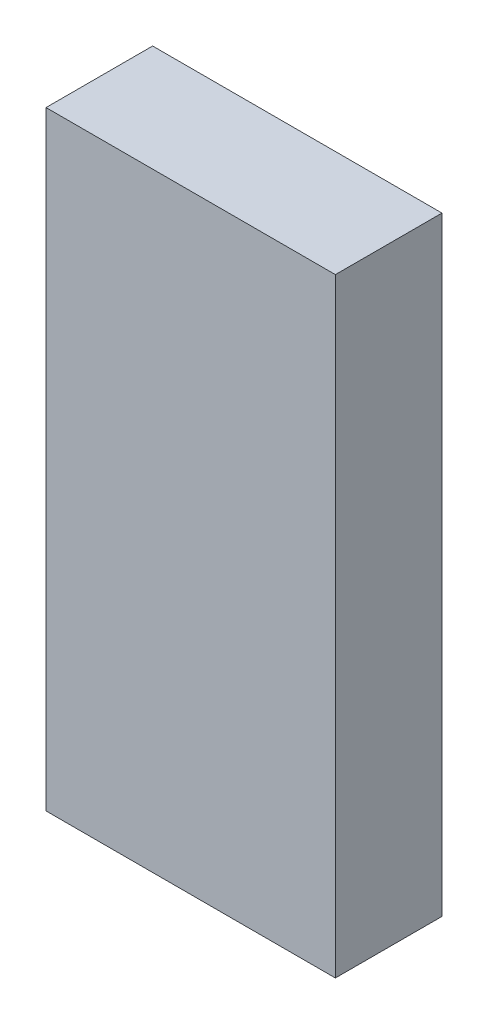
ISO-10303-21;
HEADER;
FILE_DESCRIPTION(('STEP AP214'),'2;1');
FILE_NAME('part.step','',(''),(''),'','','');
FILE_SCHEMA(('AUTOMOTIVE_DESIGN { 1 0 10303 214 1 1 1 1 }'));
ENDSEC;
DATA;
#1=APPLICATION_CONTEXT('core data for automotive mechanical design processes');
#2=APPLICATION_PROTOCOL_DEFINITION('international standard','automotive_design',2000,#1);
#3=PRODUCT_CONTEXT('',#1,'mechanical');
#4=PRODUCT('Part','Part','',(#3));
#5=PRODUCT_RELATED_PRODUCT_CATEGORY('part','',(#4));
#6=PRODUCT_DEFINITION_FORMATION('','',#4);
#7=PRODUCT_DEFINITION_CONTEXT('part definition',#1,'design');
#8=PRODUCT_DEFINITION('design','',#6,#7);
#9=PRODUCT_DEFINITION_SHAPE('','',#8);
#10=(LENGTH_UNIT() NAMED_UNIT(*) SI_UNIT(.MILLI.,.METRE.));
#11=(NAMED_UNIT(*) PLANE_ANGLE_UNIT() SI_UNIT($,.RADIAN.));
#12=(NAMED_UNIT(*) SI_UNIT($,.STERADIAN.) SOLID_ANGLE_UNIT());
#13=UNCERTAINTY_MEASURE_WITH_UNIT(LENGTH_MEASURE(1.E-05),#10,'distance_accuracy_value','');
#14=(GEOMETRIC_REPRESENTATION_CONTEXT(3) GLOBAL_UNCERTAINTY_ASSIGNED_CONTEXT((#13)) GLOBAL_UNIT_ASSIGNED_CONTEXT((#10,
#11,#12)) REPRESENTATION_CONTEXT('',''));
#15=CARTESIAN_POINT('',(0.,0.,0.));
#16=DIRECTION('',(0.,0.,1.));
#17=DIRECTION('',(1.,0.,0.));
#18=AXIS2_PLACEMENT_3D('',#15,#16,#17);
#19=CARTESIAN_POINT('',(9.5,20.,7.));
#20=DIRECTION('',(-1.,0.,0.));
#21=DIRECTION('',(0.,-1.,0.));
#22=AXIS2_PLACEMENT_3D('',#19,#20,#21);
#23=PLANE('',#22);
#24=DIRECTION('',(0.,1.,0.));
#25=VECTOR('',#24,1.);
#26=CARTESIAN_POINT('',(9.5,20.,0.));
#27=LINE('',#26,#25);
#28=CARTESIAN_POINT('',(9.5,-20.,0.));
#29=VERTEX_POINT('',#28);
#30=CARTESIAN_POINT('',(9.5,20.,0.));
#31=VERTEX_POINT('',#30);
#32=EDGE_CURVE('E96',#29,#31,#27,.T.);
#33=ORIENTED_EDGE('',*,*,#32,.T.);
#34=DIRECTION('',(0.,0.,-1.));
#35=VECTOR('',#34,1.);
#36=CARTESIAN_POINT('',(9.5,20.,7.));
#37=LINE('',#36,#35);
#38=CARTESIAN_POINT('',(9.5,20.,7.));
#39=VERTEX_POINT('',#38);
#40=EDGE_CURVE('E11',#39,#31,#37,.T.);
#41=ORIENTED_EDGE('',*,*,#40,.F.);
#42=DIRECTION('',(0.,1.,0.));
#43=VECTOR('',#42,1.);
#44=CARTESIAN_POINT('',(9.5,20.,7.));
#45=LINE('',#44,#43);
#46=CARTESIAN_POINT('',(9.5,-20.,7.));
#47=VERTEX_POINT('',#46);
#48=EDGE_CURVE('E84',#47,#39,#45,.T.);
#49=ORIENTED_EDGE('',*,*,#48,.F.);
#50=DIRECTION('',(0.,0.,-1.));
#51=VECTOR('',#50,1.);
#52=CARTESIAN_POINT('',(9.5,-20.,7.));
#53=LINE('',#52,#51);
#54=EDGE_CURVE('E92',#47,#29,#53,.T.);
#55=ORIENTED_EDGE('',*,*,#54,.T.);
#56=EDGE_LOOP('',(#33,#41,#49,#55));
#57=FACE_BOUND('',#56,.T.);
#58=ADVANCED_FACE('F33',(#57),#23,.F.);
#59=CARTESIAN_POINT('',(-9.5,20.,7.));
#60=DIRECTION('',(0.,-1.,0.));
#61=DIRECTION('',(0.,0.,-1.));
#62=AXIS2_PLACEMENT_3D('',#59,#60,#61);
#63=PLANE('',#62);
#64=DIRECTION('',(-1.,0.,0.));
#65=VECTOR('',#64,1.);
#66=CARTESIAN_POINT('',(-9.5,20.,0.));
#67=LINE('',#66,#65);
#68=CARTESIAN_POINT('',(-9.5,20.,0.));
#69=VERTEX_POINT('',#68);
#70=EDGE_CURVE('E88',#31,#69,#67,.T.);
#71=ORIENTED_EDGE('',*,*,#70,.T.);
#72=DIRECTION('',(0.,0.,-1.));
#73=VECTOR('',#72,1.);
#74=CARTESIAN_POINT('',(-9.5,20.,7.));
#75=LINE('',#74,#73);
#76=CARTESIAN_POINT('',(-9.5,20.,7.));
#77=VERTEX_POINT('',#76);
#78=EDGE_CURVE('E41',#77,#69,#75,.T.);
#79=ORIENTED_EDGE('',*,*,#78,.F.);
#80=DIRECTION('',(-1.,0.,0.));
#81=VECTOR('',#80,1.);
#82=CARTESIAN_POINT('',(-9.5,20.,7.));
#83=LINE('',#82,#81);
#84=EDGE_CURVE('E79',#39,#77,#83,.T.);
#85=ORIENTED_EDGE('',*,*,#84,.F.);
#86=ORIENTED_EDGE('',*,*,#40,.T.);
#87=EDGE_LOOP('',(#71,#79,#85,#86));
#88=FACE_BOUND('',#87,.T.);
#89=ADVANCED_FACE('F87',(#88),#63,.F.);
#90=CARTESIAN_POINT('',(-9.5,20.,7.));
#91=DIRECTION('',(1.,0.,0.));
#92=DIRECTION('',(0.,1.,0.));
#93=AXIS2_PLACEMENT_3D('',#90,#91,#92);
#94=PLANE('',#93);
#95=DIRECTION('',(0.,-1.,0.));
#96=VECTOR('',#95,1.);
#97=CARTESIAN_POINT('',(-9.5,20.,0.));
#98=LINE('',#97,#96);
#99=CARTESIAN_POINT('',(-9.5,-20.,0.));
#100=VERTEX_POINT('',#99);
#101=EDGE_CURVE('E66',#69,#100,#98,.T.);
#102=ORIENTED_EDGE('',*,*,#101,.T.);
#103=DIRECTION('',(0.,0.,-1.));
#104=VECTOR('',#103,1.);
#105=CARTESIAN_POINT('',(-9.5,-20.,7.));
#106=LINE('',#105,#104);
#107=CARTESIAN_POINT('',(-9.5,-20.,7.));
#108=VERTEX_POINT('',#107);
#109=EDGE_CURVE('E89',#108,#100,#106,.T.);
#110=ORIENTED_EDGE('',*,*,#109,.F.);
#111=DIRECTION('',(0.,-1.,0.));
#112=VECTOR('',#111,1.);
#113=CARTESIAN_POINT('',(-9.5,20.,7.));
#114=LINE('',#113,#112);
#115=EDGE_CURVE('E82',#77,#108,#114,.T.);
#116=ORIENTED_EDGE('',*,*,#115,.F.);
#117=ORIENTED_EDGE('',*,*,#78,.T.);
#118=EDGE_LOOP('',(#102,#110,#116,#117));
#119=FACE_BOUND('',#118,.T.);
#120=ADVANCED_FACE('F90',(#119),#94,.F.);
#121=CARTESIAN_POINT('',(-9.5,-20.,7.));
#122=DIRECTION('',(0.,1.,0.));
#123=DIRECTION('',(0.,0.,1.));
#124=AXIS2_PLACEMENT_3D('',#121,#122,#123);
#125=PLANE('',#124);
#126=DIRECTION('',(1.,0.,0.));
#127=VECTOR('',#126,1.);
#128=CARTESIAN_POINT('',(-9.5,-20.,0.));
#129=LINE('',#128,#127);
#130=EDGE_CURVE('E72',#100,#29,#129,.T.);
#131=ORIENTED_EDGE('',*,*,#130,.T.);
#132=ORIENTED_EDGE('',*,*,#54,.F.);
#133=DIRECTION('',(1.,0.,0.));
#134=VECTOR('',#133,1.);
#135=CARTESIAN_POINT('',(-9.5,-20.,7.));
#136=LINE('',#135,#134);
#137=EDGE_CURVE('E49',#108,#47,#136,.T.);
#138=ORIENTED_EDGE('',*,*,#137,.F.);
#139=ORIENTED_EDGE('',*,*,#109,.T.);
#140=EDGE_LOOP('',(#131,#132,#138,#139));
#141=FACE_BOUND('',#140,.T.);
#142=ADVANCED_FACE('F103',(#141),#125,.F.);
#143=CARTESIAN_POINT('',(0.,0.,7.));
#144=DIRECTION('',(0.,0.,1.));
#145=DIRECTION('',(1.,0.,0.));
#146=AXIS2_PLACEMENT_3D('',#143,#144,#145);
#147=PLANE('',#146);
#148=ORIENTED_EDGE('',*,*,#48,.T.);
#149=ORIENTED_EDGE('',*,*,#84,.T.);
#150=ORIENTED_EDGE('',*,*,#115,.T.);
#151=ORIENTED_EDGE('',*,*,#137,.T.);
#152=EDGE_LOOP('',(#148,#149,#150,#151));
#153=FACE_BOUND('',#152,.T.);
#154=ADVANCED_FACE('F80',(#153),#147,.T.);
#155=CARTESIAN_POINT('',(0.,0.,0.));
#156=DIRECTION('',(0.,0.,1.));
#157=DIRECTION('',(1.,0.,0.));
#158=AXIS2_PLACEMENT_3D('',#155,#156,#157);
#159=PLANE('',#158);
#160=ORIENTED_EDGE('',*,*,#32,.F.);
#161=ORIENTED_EDGE('',*,*,#130,.F.);
#162=ORIENTED_EDGE('',*,*,#101,.F.);
#163=ORIENTED_EDGE('',*,*,#70,.F.);
#164=EDGE_LOOP('',(#160,#161,#162,#163));
#165=FACE_BOUND('',#164,.T.);
#166=ADVANCED_FACE('F106',(#165),#159,.F.);
#167=CLOSED_SHELL('',(#58,#89,#120,#142,#154,#166));
#168=MANIFOLD_SOLID_BREP('B2',#167);
#169=ADVANCED_BREP_SHAPE_REPRESENTATION('',(#18,#168),#14);
#170=SHAPE_DEFINITION_REPRESENTATION(#9,#169);
ENDSEC;
END-ISO-10303-21;
